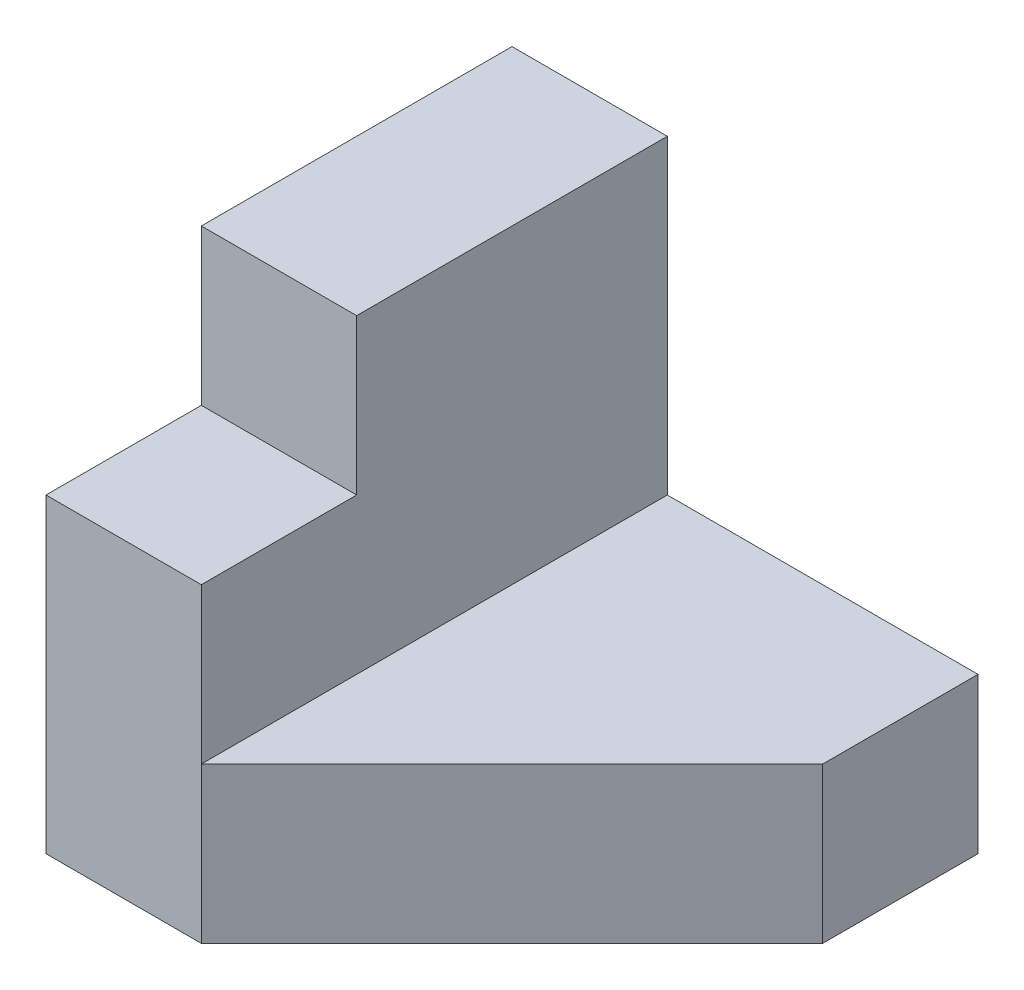
ISO-10303-21;
HEADER;
FILE_DESCRIPTION(('STEP AP214'),'2;1');
FILE_NAME('part.step','',(''),(''),'','','');
FILE_SCHEMA(('AUTOMOTIVE_DESIGN { 1 0 10303 214 1 1 1 1 }'));
ENDSEC;
DATA;
#1=APPLICATION_CONTEXT('core data for automotive mechanical design processes');
#2=APPLICATION_PROTOCOL_DEFINITION('international standard','automotive_design',2000,#1);
#3=PRODUCT_CONTEXT('',#1,'mechanical');
#4=PRODUCT('Part','Part','',(#3));
#5=PRODUCT_RELATED_PRODUCT_CATEGORY('part','',(#4));
#6=PRODUCT_DEFINITION_FORMATION('','',#4);
#7=PRODUCT_DEFINITION_CONTEXT('part definition',#1,'design');
#8=PRODUCT_DEFINITION('design','',#6,#7);
#9=PRODUCT_DEFINITION_SHAPE('','',#8);
#10=(LENGTH_UNIT() NAMED_UNIT(*) SI_UNIT(.MILLI.,.METRE.));
#11=(NAMED_UNIT(*) PLANE_ANGLE_UNIT() SI_UNIT($,.RADIAN.));
#12=(NAMED_UNIT(*) SI_UNIT($,.STERADIAN.) SOLID_ANGLE_UNIT());
#13=UNCERTAINTY_MEASURE_WITH_UNIT(LENGTH_MEASURE(1.E-05),#10,'distance_accuracy_value','');
#14=(GEOMETRIC_REPRESENTATION_CONTEXT(3) GLOBAL_UNCERTAINTY_ASSIGNED_CONTEXT((#13)) GLOBAL_UNIT_ASSIGNED_CONTEXT((#10,
#11,#12)) REPRESENTATION_CONTEXT('',''));
#15=CARTESIAN_POINT('',(0.,0.,0.));
#16=DIRECTION('',(0.,0.,1.));
#17=DIRECTION('',(1.,0.,0.));
#18=AXIS2_PLACEMENT_3D('',#15,#16,#17);
#19=CARTESIAN_POINT('',(0.,0.,-30.));
#20=DIRECTION('',(-1.,0.,0.));
#21=DIRECTION('',(0.,0.,1.));
#22=AXIS2_PLACEMENT_3D('',#19,#20,#21);
#23=PLANE('',#22);
#24=DIRECTION('',(0.,1.,0.));
#25=VECTOR('',#24,1.);
#26=CARTESIAN_POINT('',(0.,30.,-10.));
#27=LINE('',#26,#25);
#28=CARTESIAN_POINT('',(0.,20.,-10.));
#29=VERTEX_POINT('',#28);
#30=CARTESIAN_POINT('',(0.,30.,-10.));
#31=VERTEX_POINT('',#30);
#32=EDGE_CURVE('E155',#29,#31,#27,.T.);
#33=ORIENTED_EDGE('',*,*,#32,.T.);
#34=DIRECTION('',(0.,0.,1.));
#35=VECTOR('',#34,1.);
#36=CARTESIAN_POINT('',(0.,30.,-30.));
#37=LINE('',#36,#35);
#38=CARTESIAN_POINT('',(0.,30.,-30.));
#39=VERTEX_POINT('',#38);
#40=EDGE_CURVE('E11',#39,#31,#37,.T.);
#41=ORIENTED_EDGE('',*,*,#40,.F.);
#42=DIRECTION('',(0.,-1.,0.));
#43=VECTOR('',#42,1.);
#44=CARTESIAN_POINT('',(0.,0.,-30.));
#45=LINE('',#44,#43);
#46=CARTESIAN_POINT('',(0.,0.,-30.));
#47=VERTEX_POINT('',#46);
#48=EDGE_CURVE('E127',#39,#47,#45,.T.);
#49=ORIENTED_EDGE('',*,*,#48,.T.);
#50=DIRECTION('',(0.,0.,1.));
#51=VECTOR('',#50,1.);
#52=CARTESIAN_POINT('',(0.,0.,-30.));
#53=LINE('',#52,#51);
#54=CARTESIAN_POINT('',(0.,0.,0.));
#55=VERTEX_POINT('',#54);
#56=EDGE_CURVE('E36',#47,#55,#53,.T.);
#57=ORIENTED_EDGE('',*,*,#56,.T.);
#58=DIRECTION('',(0.,-1.,0.));
#59=VECTOR('',#58,1.);
#60=CARTESIAN_POINT('',(0.,0.,0.));
#61=LINE('',#60,#59);
#62=CARTESIAN_POINT('',(0.,20.,0.));
#63=VERTEX_POINT('',#62);
#64=EDGE_CURVE('E128',#63,#55,#61,.T.);
#65=ORIENTED_EDGE('',*,*,#64,.F.);
#66=DIRECTION('',(0.,0.,-1.));
#67=VECTOR('',#66,1.);
#68=CARTESIAN_POINT('',(0.,20.,0.));
#69=LINE('',#68,#67);
#70=EDGE_CURVE('E161',#63,#29,#69,.T.);
#71=ORIENTED_EDGE('',*,*,#70,.T.);
#72=EDGE_LOOP('',(#33,#41,#49,#57,#65,#71));
#73=FACE_BOUND('',#72,.T.);
#74=ADVANCED_FACE('F33',(#73),#23,.T.);
#75=CARTESIAN_POINT('',(0.,30.,-30.));
#76=DIRECTION('',(0.,1.,0.));
#77=DIRECTION('',(0.,0.,1.));
#78=AXIS2_PLACEMENT_3D('',#75,#76,#77);
#79=PLANE('',#78);
#80=DIRECTION('',(1.,0.,0.));
#81=VECTOR('',#80,1.);
#82=CARTESIAN_POINT('',(0.,30.,-10.));
#83=LINE('',#82,#81);
#84=CARTESIAN_POINT('',(10.,30.,-10.));
#85=VERTEX_POINT('',#84);
#86=EDGE_CURVE('E148',#31,#85,#83,.T.);
#87=ORIENTED_EDGE('',*,*,#86,.T.);
#88=DIRECTION('',(0.,0.,1.));
#89=VECTOR('',#88,1.);
#90=CARTESIAN_POINT('',(10.,30.,-30.));
#91=LINE('',#90,#89);
#92=CARTESIAN_POINT('',(10.,30.,-30.));
#93=VERTEX_POINT('',#92);
#94=EDGE_CURVE('E136',#93,#85,#91,.T.);
#95=ORIENTED_EDGE('',*,*,#94,.F.);
#96=DIRECTION('',(-1.,0.,0.));
#97=VECTOR('',#96,1.);
#98=CARTESIAN_POINT('',(0.,30.,-30.));
#99=LINE('',#98,#97);
#100=EDGE_CURVE('E123',#93,#39,#99,.T.);
#101=ORIENTED_EDGE('',*,*,#100,.T.);
#102=ORIENTED_EDGE('',*,*,#40,.T.);
#103=EDGE_LOOP('',(#87,#95,#101,#102));
#104=FACE_BOUND('',#103,.T.);
#105=ADVANCED_FACE('F184',(#104),#79,.T.);
#106=CARTESIAN_POINT('',(30.,0.,-30.));
#107=DIRECTION('',(1.,0.,0.));
#108=DIRECTION('',(0.,0.,-1.));
#109=AXIS2_PLACEMENT_3D('',#106,#107,#108);
#110=PLANE('',#109);
#111=DIRECTION('',(0.,1.,0.));
#112=VECTOR('',#111,1.);
#113=CARTESIAN_POINT('',(30.,0.,-20.));
#114=LINE('',#113,#112);
#115=CARTESIAN_POINT('',(30.,0.,-20.));
#116=VERTEX_POINT('',#115);
#117=CARTESIAN_POINT('',(30.,10.,-20.));
#118=VERTEX_POINT('',#117);
#119=EDGE_CURVE('E49',#116,#118,#114,.T.);
#120=ORIENTED_EDGE('',*,*,#119,.F.);
#121=DIRECTION('',(0.,0.,1.));
#122=VECTOR('',#121,1.);
#123=CARTESIAN_POINT('',(30.,0.,-30.));
#124=LINE('',#123,#122);
#125=CARTESIAN_POINT('',(30.,0.,-30.));
#126=VERTEX_POINT('',#125);
#127=EDGE_CURVE('E41',#126,#116,#124,.T.);
#128=ORIENTED_EDGE('',*,*,#127,.F.);
#129=DIRECTION('',(0.,1.,0.));
#130=VECTOR('',#129,1.);
#131=CARTESIAN_POINT('',(30.,0.,-30.));
#132=LINE('',#131,#130);
#133=CARTESIAN_POINT('',(30.,10.,-30.));
#134=VERTEX_POINT('',#133);
#135=EDGE_CURVE('E131',#126,#134,#132,.T.);
#136=ORIENTED_EDGE('',*,*,#135,.T.);
#137=DIRECTION('',(0.,0.,1.));
#138=VECTOR('',#137,1.);
#139=CARTESIAN_POINT('',(30.,10.,-30.));
#140=LINE('',#139,#138);
#141=EDGE_CURVE('E116',#134,#118,#140,.T.);
#142=ORIENTED_EDGE('',*,*,#141,.T.);
#143=EDGE_LOOP('',(#120,#128,#136,#142));
#144=FACE_BOUND('',#143,.T.);
#145=ADVANCED_FACE('F113',(#144),#110,.T.);
#146=CARTESIAN_POINT('',(0.,0.,-30.));
#147=DIRECTION('',(0.,-1.,0.));
#148=DIRECTION('',(0.,0.,-1.));
#149=AXIS2_PLACEMENT_3D('',#146,#147,#148);
#150=PLANE('',#149);
#151=DIRECTION('',(-0.707106781186548,0.,0.707106781186548));
#152=VECTOR('',#151,1.);
#153=CARTESIAN_POINT('',(10.,0.,0.));
#154=LINE('',#153,#152);
#155=CARTESIAN_POINT('',(10.,0.,0.));
#156=VERTEX_POINT('',#155);
#157=EDGE_CURVE('E101',#116,#156,#154,.T.);
#158=ORIENTED_EDGE('',*,*,#157,.T.);
#159=DIRECTION('',(1.,0.,0.));
#160=VECTOR('',#159,1.);
#161=CARTESIAN_POINT('',(0.,0.,0.));
#162=LINE('',#161,#160);
#163=EDGE_CURVE('E125',#55,#156,#162,.T.);
#164=ORIENTED_EDGE('',*,*,#163,.F.);
#165=ORIENTED_EDGE('',*,*,#56,.F.);
#166=DIRECTION('',(1.,0.,0.));
#167=VECTOR('',#166,1.);
#168=CARTESIAN_POINT('',(0.,0.,-30.));
#169=LINE('',#168,#167);
#170=EDGE_CURVE('E121',#47,#126,#169,.T.);
#171=ORIENTED_EDGE('',*,*,#170,.T.);
#172=ORIENTED_EDGE('',*,*,#127,.T.);
#173=EDGE_LOOP('',(#158,#164,#165,#171,#172));
#174=FACE_BOUND('',#173,.T.);
#175=ADVANCED_FACE('F119',(#174),#150,.T.);
#176=CARTESIAN_POINT('',(0.,0.,-30.));
#177=DIRECTION('',(0.,0.,-1.));
#178=DIRECTION('',(-1.,0.,0.));
#179=AXIS2_PLACEMENT_3D('',#176,#177,#178);
#180=PLANE('',#179);
#181=DIRECTION('',(1.,0.,0.));
#182=VECTOR('',#181,1.);
#183=CARTESIAN_POINT('',(30.,10.,-30.));
#184=LINE('',#183,#182);
#185=CARTESIAN_POINT('',(10.,10.,-30.));
#186=VERTEX_POINT('',#185);
#187=EDGE_CURVE('E140',#186,#134,#184,.T.);
#188=ORIENTED_EDGE('',*,*,#187,.T.);
#189=ORIENTED_EDGE('',*,*,#135,.F.);
#190=ORIENTED_EDGE('',*,*,#170,.F.);
#191=ORIENTED_EDGE('',*,*,#48,.F.);
#192=ORIENTED_EDGE('',*,*,#100,.F.);
#193=DIRECTION('',(0.,-1.,0.));
#194=VECTOR('',#193,1.);
#195=CARTESIAN_POINT('',(10.,30.,-30.));
#196=LINE('',#195,#194);
#197=EDGE_CURVE('E147',#93,#186,#196,.T.);
#198=ORIENTED_EDGE('',*,*,#197,.T.);
#199=EDGE_LOOP('',(#188,#189,#190,#191,#192,#198));
#200=FACE_BOUND('',#199,.T.);
#201=ADVANCED_FACE('F180',(#200),#180,.T.);
#202=CARTESIAN_POINT('',(0.,0.,0.));
#203=DIRECTION('',(0.,0.,-1.));
#204=DIRECTION('',(-1.,0.,0.));
#205=AXIS2_PLACEMENT_3D('',#202,#203,#204);
#206=PLANE('',#205);
#207=ORIENTED_EDGE('',*,*,#163,.T.);
#208=DIRECTION('',(0.,1.,0.));
#209=VECTOR('',#208,1.);
#210=CARTESIAN_POINT('',(10.,0.,0.));
#211=LINE('',#210,#209);
#212=CARTESIAN_POINT('',(10.,10.,0.));
#213=VERTEX_POINT('',#212);
#214=EDGE_CURVE('E104',#156,#213,#211,.T.);
#215=ORIENTED_EDGE('',*,*,#214,.T.);
#216=DIRECTION('',(0.,-1.,0.));
#217=VECTOR('',#216,1.);
#218=CARTESIAN_POINT('',(10.,30.,0.));
#219=LINE('',#218,#217);
#220=CARTESIAN_POINT('',(10.,20.,0.));
#221=VERTEX_POINT('',#220);
#222=EDGE_CURVE('E144',#221,#213,#219,.T.);
#223=ORIENTED_EDGE('',*,*,#222,.F.);
#224=DIRECTION('',(1.,0.,0.));
#225=VECTOR('',#224,1.);
#226=CARTESIAN_POINT('',(0.,20.,0.));
#227=LINE('',#226,#225);
#228=EDGE_CURVE('E57',#63,#221,#227,.T.);
#229=ORIENTED_EDGE('',*,*,#228,.F.);
#230=ORIENTED_EDGE('',*,*,#64,.T.);
#231=EDGE_LOOP('',(#207,#215,#223,#229,#230));
#232=FACE_BOUND('',#231,.T.);
#233=ADVANCED_FACE('F172',(#232),#206,.F.);
#234=CARTESIAN_POINT('',(30.,10.,-30.));
#235=DIRECTION('',(0.,-1.,0.));
#236=DIRECTION('',(1.,0.,0.));
#237=AXIS2_PLACEMENT_3D('',#234,#235,#236);
#238=PLANE('',#237);
#239=DIRECTION('',(0.,0.,1.));
#240=VECTOR('',#239,1.);
#241=CARTESIAN_POINT('',(10.,10.,-30.));
#242=LINE('',#241,#240);
#243=EDGE_CURVE('E139',#186,#213,#242,.T.);
#244=ORIENTED_EDGE('',*,*,#243,.T.);
#245=DIRECTION('',(-0.707106781186548,0.,0.707106781186548));
#246=VECTOR('',#245,1.);
#247=CARTESIAN_POINT('',(10.,10.,0.));
#248=LINE('',#247,#246);
#249=EDGE_CURVE('E109',#118,#213,#248,.T.);
#250=ORIENTED_EDGE('',*,*,#249,.F.);
#251=ORIENTED_EDGE('',*,*,#141,.F.);
#252=ORIENTED_EDGE('',*,*,#187,.F.);
#253=EDGE_LOOP('',(#244,#250,#251,#252));
#254=FACE_BOUND('',#253,.T.);
#255=ADVANCED_FACE('F177',(#254),#238,.F.);
#256=CARTESIAN_POINT('',(10.,30.,-30.));
#257=DIRECTION('',(-1.,0.,0.));
#258=DIRECTION('',(0.,0.,1.));
#259=AXIS2_PLACEMENT_3D('',#256,#257,#258);
#260=PLANE('',#259);
#261=ORIENTED_EDGE('',*,*,#94,.T.);
#262=DIRECTION('',(0.,1.,0.));
#263=VECTOR('',#262,1.);
#264=CARTESIAN_POINT('',(10.,30.,-10.));
#265=LINE('',#264,#263);
#266=CARTESIAN_POINT('',(10.,20.,-10.));
#267=VERTEX_POINT('',#266);
#268=EDGE_CURVE('E159',#267,#85,#265,.T.);
#269=ORIENTED_EDGE('',*,*,#268,.F.);
#270=DIRECTION('',(0.,0.,-1.));
#271=VECTOR('',#270,1.);
#272=CARTESIAN_POINT('',(10.,20.,0.));
#273=LINE('',#272,#271);
#274=EDGE_CURVE('E162',#221,#267,#273,.T.);
#275=ORIENTED_EDGE('',*,*,#274,.F.);
#276=ORIENTED_EDGE('',*,*,#222,.T.);
#277=ORIENTED_EDGE('',*,*,#243,.F.);
#278=ORIENTED_EDGE('',*,*,#197,.F.);
#279=EDGE_LOOP('',(#261,#269,#275,#276,#277,#278));
#280=FACE_BOUND('',#279,.T.);
#281=ADVANCED_FACE('F174',(#280),#260,.F.);
#282=CARTESIAN_POINT('',(0.,30.,-10.));
#283=DIRECTION('',(0.,0.,-1.));
#284=DIRECTION('',(0.,1.,0.));
#285=AXIS2_PLACEMENT_3D('',#282,#283,#284);
#286=PLANE('',#285);
#287=ORIENTED_EDGE('',*,*,#268,.T.);
#288=ORIENTED_EDGE('',*,*,#86,.F.);
#289=ORIENTED_EDGE('',*,*,#32,.F.);
#290=DIRECTION('',(1.,0.,0.));
#291=VECTOR('',#290,1.);
#292=CARTESIAN_POINT('',(0.,20.,-10.));
#293=LINE('',#292,#291);
#294=EDGE_CURVE('E154',#29,#267,#293,.T.);
#295=ORIENTED_EDGE('',*,*,#294,.T.);
#296=EDGE_LOOP('',(#287,#288,#289,#295));
#297=FACE_BOUND('',#296,.T.);
#298=ADVANCED_FACE('F188',(#297),#286,.F.);
#299=CARTESIAN_POINT('',(0.,20.,0.));
#300=DIRECTION('',(0.,-1.,0.));
#301=DIRECTION('',(0.,0.,-1.));
#302=AXIS2_PLACEMENT_3D('',#299,#300,#301);
#303=PLANE('',#302);
#304=ORIENTED_EDGE('',*,*,#274,.T.);
#305=ORIENTED_EDGE('',*,*,#294,.F.);
#306=ORIENTED_EDGE('',*,*,#70,.F.);
#307=ORIENTED_EDGE('',*,*,#228,.T.);
#308=EDGE_LOOP('',(#304,#305,#306,#307));
#309=FACE_BOUND('',#308,.T.);
#310=ADVANCED_FACE('F191',(#309),#303,.F.);
#311=CARTESIAN_POINT('',(10.,0.,0.));
#312=DIRECTION('',(-0.707106781186547,0.,-0.707106781186547));
#313=DIRECTION('',(-0.707106781186548,0.,0.707106781186548));
#314=AXIS2_PLACEMENT_3D('',#311,#312,#313);
#315=PLANE('',#314);
#316=ORIENTED_EDGE('',*,*,#249,.T.);
#317=ORIENTED_EDGE('',*,*,#214,.F.);
#318=ORIENTED_EDGE('',*,*,#157,.F.);
#319=ORIENTED_EDGE('',*,*,#119,.T.);
#320=EDGE_LOOP('',(#316,#317,#318,#319));
#321=FACE_BOUND('',#320,.T.);
#322=ADVANCED_FACE('F102',(#321),#315,.F.);
#323=CLOSED_SHELL('',(#74,#105,#145,#175,#201,#233,#255,#281,#298,#310,#322));
#324=MANIFOLD_SOLID_BREP('B2',#323);
#325=ADVANCED_BREP_SHAPE_REPRESENTATION('',(#18,#324),#14);
#326=SHAPE_DEFINITION_REPRESENTATION(#9,#325);
ENDSEC;
END-ISO-10303-21;
